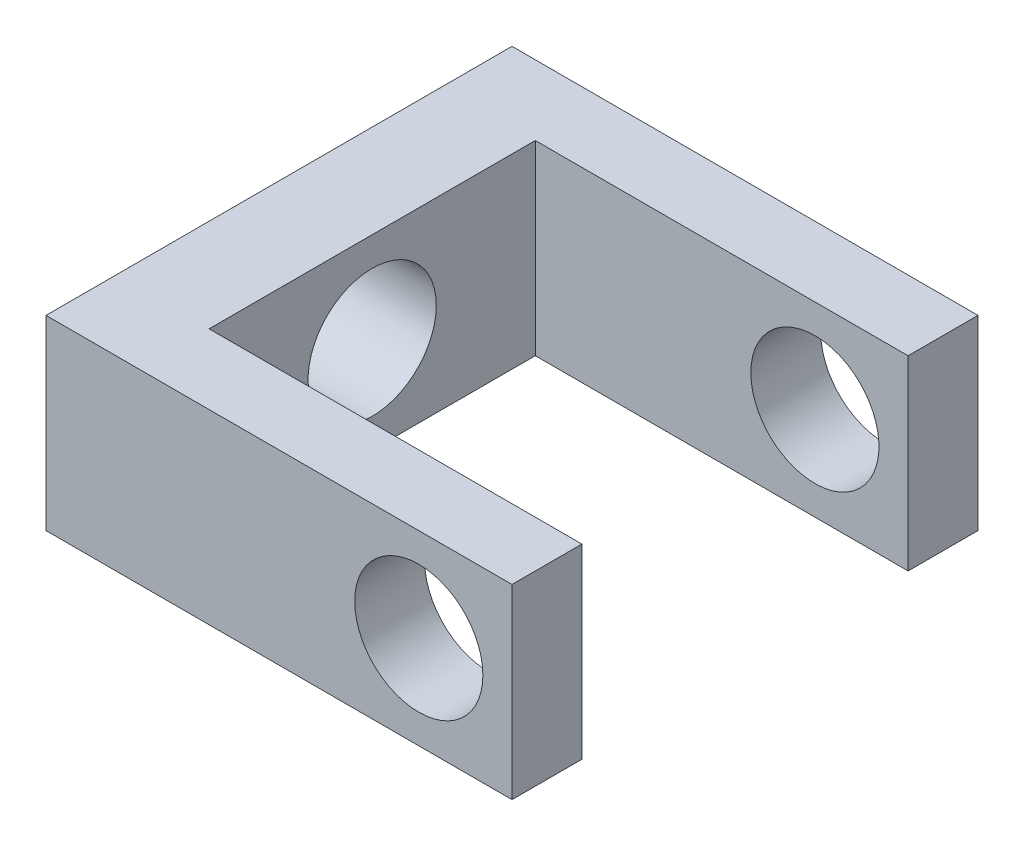
ISO-10303-21;
HEADER;
FILE_DESCRIPTION(('STEP AP214'),'2;1');
FILE_NAME('part.step','',(''),(''),'','','');
FILE_SCHEMA(('AUTOMOTIVE_DESIGN { 1 0 10303 214 1 1 1 1 }'));
ENDSEC;
DATA;
#1=APPLICATION_CONTEXT('core data for automotive mechanical design processes');
#2=APPLICATION_PROTOCOL_DEFINITION('international standard','automotive_design',2000,#1);
#3=PRODUCT_CONTEXT('',#1,'mechanical');
#4=PRODUCT('Part','Part','',(#3));
#5=PRODUCT_RELATED_PRODUCT_CATEGORY('part','',(#4));
#6=PRODUCT_DEFINITION_FORMATION('','',#4);
#7=PRODUCT_DEFINITION_CONTEXT('part definition',#1,'design');
#8=PRODUCT_DEFINITION('design','',#6,#7);
#9=PRODUCT_DEFINITION_SHAPE('','',#8);
#10=(LENGTH_UNIT() NAMED_UNIT(*) SI_UNIT(.MILLI.,.METRE.));
#11=(NAMED_UNIT(*) PLANE_ANGLE_UNIT() SI_UNIT($,.RADIAN.));
#12=(NAMED_UNIT(*) SI_UNIT($,.STERADIAN.) SOLID_ANGLE_UNIT());
#13=UNCERTAINTY_MEASURE_WITH_UNIT(LENGTH_MEASURE(1.E-05),#10,'distance_accuracy_value','');
#14=(GEOMETRIC_REPRESENTATION_CONTEXT(3) GLOBAL_UNCERTAINTY_ASSIGNED_CONTEXT((#13)) GLOBAL_UNIT_ASSIGNED_CONTEXT((#10,
#11,#12)) REPRESENTATION_CONTEXT('',''));
#15=CARTESIAN_POINT('',(0.,0.,0.));
#16=DIRECTION('',(0.,0.,1.));
#17=DIRECTION('',(1.,0.,0.));
#18=AXIS2_PLACEMENT_3D('',#15,#16,#17);
#19=CARTESIAN_POINT('',(10.,-4.,20.));
#20=DIRECTION('',(-1.,0.,0.));
#21=DIRECTION('',(0.,0.,1.));
#22=AXIS2_PLACEMENT_3D('',#19,#20,#21);
#23=PLANE('',#22);
#24=DIRECTION('',(0.,1.,0.));
#25=VECTOR('',#24,1.);
#26=CARTESIAN_POINT('',(10.,0.,17.));
#27=LINE('',#26,#25);
#28=CARTESIAN_POINT('',(10.,-4.,17.));
#29=VERTEX_POINT('',#28);
#30=CARTESIAN_POINT('',(10.,4.,17.));
#31=VERTEX_POINT('',#30);
#32=EDGE_CURVE('E130',#29,#31,#27,.T.);
#33=ORIENTED_EDGE('',*,*,#32,.T.);
#34=DIRECTION('',(0.,0.,-1.));
#35=VECTOR('',#34,1.);
#36=CARTESIAN_POINT('',(10.,4.,20.));
#37=LINE('',#36,#35);
#38=CARTESIAN_POINT('',(10.,4.,20.));
#39=VERTEX_POINT('',#38);
#40=EDGE_CURVE('E11',#39,#31,#37,.T.);
#41=ORIENTED_EDGE('',*,*,#40,.F.);
#42=DIRECTION('',(0.,1.,0.));
#43=VECTOR('',#42,1.);
#44=CARTESIAN_POINT('',(10.,-4.,20.));
#45=LINE('',#44,#43);
#46=CARTESIAN_POINT('',(10.,-4.,20.));
#47=VERTEX_POINT('',#46);
#48=EDGE_CURVE('E146',#47,#39,#45,.T.);
#49=ORIENTED_EDGE('',*,*,#48,.F.);
#50=DIRECTION('',(0.,0.,-1.));
#51=VECTOR('',#50,1.);
#52=CARTESIAN_POINT('',(10.,-4.,20.));
#53=LINE('',#52,#51);
#54=EDGE_CURVE('E159',#47,#29,#53,.T.);
#55=ORIENTED_EDGE('',*,*,#54,.T.);
#56=EDGE_LOOP('',(#33,#41,#49,#55));
#57=FACE_BOUND('',#56,.T.);
#58=ADVANCED_FACE('F39',(#57),#23,.F.);
#59=CARTESIAN_POINT('',(-10.,4.,20.));
#60=DIRECTION('',(0.,-1.,0.));
#61=DIRECTION('',(0.,0.,-1.));
#62=AXIS2_PLACEMENT_3D('',#59,#60,#61);
#63=PLANE('',#62);
#64=DIRECTION('',(1.,0.,0.));
#65=VECTOR('',#64,1.);
#66=CARTESIAN_POINT('',(-6.,4.,17.));
#67=LINE('',#66,#65);
#68=CARTESIAN_POINT('',(-6.,4.,17.));
#69=VERTEX_POINT('',#68);
#70=EDGE_CURVE('E134',#69,#31,#67,.T.);
#71=ORIENTED_EDGE('',*,*,#70,.F.);
#72=DIRECTION('',(0.,0.,1.));
#73=VECTOR('',#72,1.);
#74=CARTESIAN_POINT('',(-6.,4.,0.));
#75=LINE('',#74,#73);
#76=CARTESIAN_POINT('',(-6.,4.,3.));
#77=VERTEX_POINT('',#76);
#78=EDGE_CURVE('E123',#77,#69,#75,.T.);
#79=ORIENTED_EDGE('',*,*,#78,.F.);
#80=DIRECTION('',(1.,0.,0.));
#81=VECTOR('',#80,1.);
#82=CARTESIAN_POINT('',(-6.,4.,3.));
#83=LINE('',#82,#81);
#84=CARTESIAN_POINT('',(10.,4.,3.));
#85=VERTEX_POINT('',#84);
#86=EDGE_CURVE('E121',#77,#85,#83,.T.);
#87=ORIENTED_EDGE('',*,*,#86,.T.);
#88=CARTESIAN_POINT('',(10.,4.,0.));
#89=VERTEX_POINT('',#88);
#90=EDGE_CURVE('E48',#85,#89,#37,.T.);
#91=ORIENTED_EDGE('',*,*,#90,.T.);
#92=DIRECTION('',(-1.,0.,0.));
#93=VECTOR('',#92,1.);
#94=CARTESIAN_POINT('',(-10.,4.,0.));
#95=LINE('',#94,#93);
#96=CARTESIAN_POINT('',(-10.,4.,0.));
#97=VERTEX_POINT('',#96);
#98=EDGE_CURVE('E154',#89,#97,#95,.T.);
#99=ORIENTED_EDGE('',*,*,#98,.T.);
#100=DIRECTION('',(0.,0.,-1.));
#101=VECTOR('',#100,1.);
#102=CARTESIAN_POINT('',(-10.,4.,20.));
#103=LINE('',#102,#101);
#104=CARTESIAN_POINT('',(-10.,4.,20.));
#105=VERTEX_POINT('',#104);
#106=EDGE_CURVE('E165',#105,#97,#103,.T.);
#107=ORIENTED_EDGE('',*,*,#106,.F.);
#108=DIRECTION('',(-1.,0.,0.));
#109=VECTOR('',#108,1.);
#110=CARTESIAN_POINT('',(-10.,4.,20.));
#111=LINE('',#110,#109);
#112=EDGE_CURVE('E94',#39,#105,#111,.T.);
#113=ORIENTED_EDGE('',*,*,#112,.F.);
#114=ORIENTED_EDGE('',*,*,#40,.T.);
#115=EDGE_LOOP('',(#71,#79,#87,#91,#99,#107,#113,#114));
#116=FACE_BOUND('',#115,.T.);
#117=ADVANCED_FACE('F205',(#116),#63,.F.);
#118=CARTESIAN_POINT('',(-10.,-4.,20.));
#119=DIRECTION('',(0.,1.,0.));
#120=DIRECTION('',(0.,0.,1.));
#121=AXIS2_PLACEMENT_3D('',#118,#119,#120);
#122=PLANE('',#121);
#123=DIRECTION('',(1.,0.,0.));
#124=VECTOR('',#123,1.);
#125=CARTESIAN_POINT('',(-6.,-4.,17.));
#126=LINE('',#125,#124);
#127=CARTESIAN_POINT('',(-6.,-4.,17.));
#128=VERTEX_POINT('',#127);
#129=EDGE_CURVE('E169',#128,#29,#126,.T.);
#130=ORIENTED_EDGE('',*,*,#129,.T.);
#131=ORIENTED_EDGE('',*,*,#54,.F.);
#132=DIRECTION('',(1.,0.,0.));
#133=VECTOR('',#132,1.);
#134=CARTESIAN_POINT('',(-10.,-4.,20.));
#135=LINE('',#134,#133);
#136=CARTESIAN_POINT('',(-10.,-4.,20.));
#137=VERTEX_POINT('',#136);
#138=EDGE_CURVE('E65',#137,#47,#135,.T.);
#139=ORIENTED_EDGE('',*,*,#138,.F.);
#140=DIRECTION('',(0.,0.,-1.));
#141=VECTOR('',#140,1.);
#142=CARTESIAN_POINT('',(-10.,-4.,20.));
#143=LINE('',#142,#141);
#144=CARTESIAN_POINT('',(-10.,-4.,0.));
#145=VERTEX_POINT('',#144);
#146=EDGE_CURVE('E162',#137,#145,#143,.T.);
#147=ORIENTED_EDGE('',*,*,#146,.T.);
#148=DIRECTION('',(1.,0.,0.));
#149=VECTOR('',#148,1.);
#150=CARTESIAN_POINT('',(-10.,-4.,0.));
#151=LINE('',#150,#149);
#152=CARTESIAN_POINT('',(10.,-4.,0.));
#153=VERTEX_POINT('',#152);
#154=EDGE_CURVE('E148',#145,#153,#151,.T.);
#155=ORIENTED_EDGE('',*,*,#154,.T.);
#156=CARTESIAN_POINT('',(10.,-4.,3.));
#157=VERTEX_POINT('',#156);
#158=EDGE_CURVE('E87',#157,#153,#53,.T.);
#159=ORIENTED_EDGE('',*,*,#158,.F.);
#160=DIRECTION('',(1.,0.,0.));
#161=VECTOR('',#160,1.);
#162=CARTESIAN_POINT('',(-6.,-4.,3.));
#163=LINE('',#162,#161);
#164=CARTESIAN_POINT('',(-6.,-4.,3.));
#165=VERTEX_POINT('',#164);
#166=EDGE_CURVE('E119',#165,#157,#163,.T.);
#167=ORIENTED_EDGE('',*,*,#166,.F.);
#168=DIRECTION('',(0.,0.,-1.));
#169=VECTOR('',#168,1.);
#170=CARTESIAN_POINT('',(-6.,-4.,0.));
#171=LINE('',#170,#169);
#172=EDGE_CURVE('E124',#128,#165,#171,.T.);
#173=ORIENTED_EDGE('',*,*,#172,.F.);
#174=EDGE_LOOP('',(#130,#131,#139,#147,#155,#159,#167,#173));
#175=FACE_BOUND('',#174,.T.);
#176=ADVANCED_FACE('F132',(#175),#122,.F.);
#177=CARTESIAN_POINT('',(6.,0.,20.));
#178=DIRECTION('',(0.,0.,-1.));
#179=DIRECTION('',(-1.,0.,0.));
#180=AXIS2_PLACEMENT_3D('',#177,#178,#179);
#181=CYLINDRICAL_SURFACE('',#180,2.75);
#182=CARTESIAN_POINT('',(6.,0.,20.));
#183=DIRECTION('',(0.,0.,1.));
#184=DIRECTION('',(1.,0.,0.));
#185=AXIS2_PLACEMENT_3D('',#182,#183,#184);
#186=CIRCLE('',#185,2.75);
#187=CARTESIAN_POINT('',(8.75,0.,20.));
#188=VERTEX_POINT('',#187);
#189=EDGE_CURVE('E139',#188,#188,#186,.T.);
#190=ORIENTED_EDGE('',*,*,#189,.T.);
#191=EDGE_LOOP('',(#190));
#192=FACE_BOUND('',#191,.T.);
#193=CARTESIAN_POINT('',(6.,0.,17.));
#194=DIRECTION('',(0.,0.,-1.));
#195=DIRECTION('',(-1.,0.,0.));
#196=AXIS2_PLACEMENT_3D('',#193,#194,#195);
#197=CIRCLE('',#196,2.75);
#198=CARTESIAN_POINT('',(3.25,0.,17.));
#199=VERTEX_POINT('',#198);
#200=EDGE_CURVE('E43',#199,#199,#197,.T.);
#201=ORIENTED_EDGE('',*,*,#200,.T.);
#202=EDGE_LOOP('',(#201));
#203=FACE_BOUND('',#202,.T.);
#204=ADVANCED_FACE('F234',(#192,#203),#181,.F.);
#205=CARTESIAN_POINT('',(0.,0.,20.));
#206=DIRECTION('',(0.,0.,-1.));
#207=DIRECTION('',(-1.,0.,0.));
#208=AXIS2_PLACEMENT_3D('',#205,#206,#207);
#209=PLANE('',#208);
#210=ORIENTED_EDGE('',*,*,#48,.T.);
#211=ORIENTED_EDGE('',*,*,#112,.T.);
#212=DIRECTION('',(0.,-1.,0.));
#213=VECTOR('',#212,1.);
#214=CARTESIAN_POINT('',(-10.,-4.,20.));
#215=LINE('',#214,#213);
#216=EDGE_CURVE('E150',#105,#137,#215,.T.);
#217=ORIENTED_EDGE('',*,*,#216,.T.);
#218=ORIENTED_EDGE('',*,*,#138,.T.);
#219=EDGE_LOOP('',(#210,#211,#217,#218));
#220=FACE_BOUND('',#219,.T.);
#221=ORIENTED_EDGE('',*,*,#189,.F.);
#222=EDGE_LOOP('',(#221));
#223=FACE_BOUND('',#222,.T.);
#224=ADVANCED_FACE('F218',(#220,#223),#209,.F.);
#225=CARTESIAN_POINT('',(0.,0.,0.));
#226=DIRECTION('',(0.,0.,-1.));
#227=DIRECTION('',(-1.,0.,0.));
#228=AXIS2_PLACEMENT_3D('',#225,#226,#227);
#229=PLANE('',#228);
#230=DIRECTION('',(0.,1.,0.));
#231=VECTOR('',#230,1.);
#232=CARTESIAN_POINT('',(10.,-4.,0.));
#233=LINE('',#232,#231);
#234=EDGE_CURVE('E142',#153,#89,#233,.T.);
#235=ORIENTED_EDGE('',*,*,#234,.F.);
#236=ORIENTED_EDGE('',*,*,#154,.F.);
#237=DIRECTION('',(0.,-1.,0.));
#238=VECTOR('',#237,1.);
#239=CARTESIAN_POINT('',(-10.,-4.,0.));
#240=LINE('',#239,#238);
#241=EDGE_CURVE('E156',#97,#145,#240,.T.);
#242=ORIENTED_EDGE('',*,*,#241,.F.);
#243=ORIENTED_EDGE('',*,*,#98,.F.);
#244=EDGE_LOOP('',(#235,#236,#242,#243));
#245=FACE_BOUND('',#244,.T.);
#246=CARTESIAN_POINT('',(6.,0.,0.));
#247=DIRECTION('',(0.,0.,1.));
#248=DIRECTION('',(1.,0.,0.));
#249=AXIS2_PLACEMENT_3D('',#246,#247,#248);
#250=CIRCLE('',#249,2.75);
#251=CARTESIAN_POINT('',(8.75,0.,0.));
#252=VERTEX_POINT('',#251);
#253=EDGE_CURVE('E143',#252,#252,#250,.T.);
#254=ORIENTED_EDGE('',*,*,#253,.T.);
#255=EDGE_LOOP('',(#254));
#256=FACE_BOUND('',#255,.T.);
#257=ADVANCED_FACE('F211',(#245,#256),#229,.T.);
#258=ORIENTED_EDGE('',*,*,#90,.F.);
#259=DIRECTION('',(0.,1.,0.));
#260=VECTOR('',#259,1.);
#261=CARTESIAN_POINT('',(10.,0.,3.));
#262=LINE('',#261,#260);
#263=EDGE_CURVE('E177',#157,#85,#262,.T.);
#264=ORIENTED_EDGE('',*,*,#263,.F.);
#265=ORIENTED_EDGE('',*,*,#158,.T.);
#266=ORIENTED_EDGE('',*,*,#234,.T.);
#267=EDGE_LOOP('',(#258,#264,#265,#266));
#268=FACE_BOUND('',#267,.T.);
#269=ADVANCED_FACE('F41',(#268),#23,.F.);
#270=CARTESIAN_POINT('',(-10.,-4.,20.));
#271=DIRECTION('',(1.,0.,0.));
#272=DIRECTION('',(0.,0.,-1.));
#273=AXIS2_PLACEMENT_3D('',#270,#271,#272);
#274=PLANE('',#273);
#275=CARTESIAN_POINT('',(-10.,0.,10.));
#276=DIRECTION('',(1.,0.,0.));
#277=DIRECTION('',(0.,0.,-1.));
#278=AXIS2_PLACEMENT_3D('',#275,#276,#277);
#279=CIRCLE('',#278,2.75);
#280=CARTESIAN_POINT('',(-10.,0.,7.25));
#281=VERTEX_POINT('',#280);
#282=EDGE_CURVE('E178',#281,#281,#279,.T.);
#283=ORIENTED_EDGE('',*,*,#282,.T.);
#284=EDGE_LOOP('',(#283));
#285=FACE_BOUND('',#284,.T.);
#286=ORIENTED_EDGE('',*,*,#241,.T.);
#287=ORIENTED_EDGE('',*,*,#146,.F.);
#288=ORIENTED_EDGE('',*,*,#216,.F.);
#289=ORIENTED_EDGE('',*,*,#106,.T.);
#290=EDGE_LOOP('',(#286,#287,#288,#289));
#291=FACE_BOUND('',#290,.T.);
#292=ADVANCED_FACE('F187',(#285,#291),#274,.F.);
#293=CARTESIAN_POINT('',(6.,0.,3.));
#294=DIRECTION('',(0.,0.,-1.));
#295=DIRECTION('',(-1.,0.,0.));
#296=AXIS2_PLACEMENT_3D('',#293,#294,#295);
#297=CIRCLE('',#296,2.75);
#298=CARTESIAN_POINT('',(3.25,0.,3.));
#299=VERTEX_POINT('',#298);
#300=EDGE_CURVE('E167',#299,#299,#297,.T.);
#301=ORIENTED_EDGE('',*,*,#300,.F.);
#302=EDGE_LOOP('',(#301));
#303=FACE_BOUND('',#302,.T.);
#304=ORIENTED_EDGE('',*,*,#253,.F.);
#305=EDGE_LOOP('',(#304));
#306=FACE_BOUND('',#305,.T.);
#307=ADVANCED_FACE('F216',(#303,#306),#181,.F.);
#308=CARTESIAN_POINT('',(-6.,0.,17.));
#309=DIRECTION('',(0.,0.,-1.));
#310=DIRECTION('',(-1.,0.,0.));
#311=AXIS2_PLACEMENT_3D('',#308,#309,#310);
#312=PLANE('',#311);
#313=ORIENTED_EDGE('',*,*,#200,.F.);
#314=EDGE_LOOP('',(#313));
#315=FACE_BOUND('',#314,.T.);
#316=ORIENTED_EDGE('',*,*,#32,.F.);
#317=ORIENTED_EDGE('',*,*,#129,.F.);
#318=DIRECTION('',(0.,1.,0.));
#319=VECTOR('',#318,1.);
#320=CARTESIAN_POINT('',(-6.,0.,17.));
#321=LINE('',#320,#319);
#322=EDGE_CURVE('E56',#128,#69,#321,.T.);
#323=ORIENTED_EDGE('',*,*,#322,.T.);
#324=ORIENTED_EDGE('',*,*,#70,.T.);
#325=EDGE_LOOP('',(#316,#317,#323,#324));
#326=FACE_BOUND('',#325,.T.);
#327=ADVANCED_FACE('F201',(#315,#326),#312,.T.);
#328=CARTESIAN_POINT('',(-6.,0.,3.));
#329=DIRECTION('',(0.,0.,-1.));
#330=DIRECTION('',(-1.,0.,0.));
#331=AXIS2_PLACEMENT_3D('',#328,#329,#330);
#332=PLANE('',#331);
#333=ORIENTED_EDGE('',*,*,#300,.T.);
#334=EDGE_LOOP('',(#333));
#335=FACE_BOUND('',#334,.T.);
#336=ORIENTED_EDGE('',*,*,#263,.T.);
#337=ORIENTED_EDGE('',*,*,#86,.F.);
#338=DIRECTION('',(0.,1.,0.));
#339=VECTOR('',#338,1.);
#340=CARTESIAN_POINT('',(-6.,0.,3.));
#341=LINE('',#340,#339);
#342=EDGE_CURVE('E116',#165,#77,#341,.T.);
#343=ORIENTED_EDGE('',*,*,#342,.F.);
#344=ORIENTED_EDGE('',*,*,#166,.T.);
#345=EDGE_LOOP('',(#336,#337,#343,#344));
#346=FACE_BOUND('',#345,.T.);
#347=ADVANCED_FACE('F117',(#335,#346),#332,.F.);
#348=CARTESIAN_POINT('',(-6.,0.,0.));
#349=DIRECTION('',(1.,0.,0.));
#350=DIRECTION('',(0.,0.,-1.));
#351=AXIS2_PLACEMENT_3D('',#348,#349,#350);
#352=PLANE('',#351);
#353=CARTESIAN_POINT('',(-6.,0.,10.));
#354=DIRECTION('',(1.,0.,0.));
#355=DIRECTION('',(0.,0.,-1.));
#356=AXIS2_PLACEMENT_3D('',#353,#354,#355);
#357=CIRCLE('',#356,2.75);
#358=CARTESIAN_POINT('',(-6.,0.,7.25));
#359=VERTEX_POINT('',#358);
#360=EDGE_CURVE('E181',#359,#359,#357,.T.);
#361=ORIENTED_EDGE('',*,*,#360,.F.);
#362=EDGE_LOOP('',(#361));
#363=FACE_BOUND('',#362,.T.);
#364=ORIENTED_EDGE('',*,*,#172,.T.);
#365=ORIENTED_EDGE('',*,*,#342,.T.);
#366=ORIENTED_EDGE('',*,*,#78,.T.);
#367=ORIENTED_EDGE('',*,*,#322,.F.);
#368=EDGE_LOOP('',(#364,#365,#366,#367));
#369=FACE_BOUND('',#368,.T.);
#370=ADVANCED_FACE('F127',(#363,#369),#352,.T.);
#371=CARTESIAN_POINT('',(-10.,0.,10.));
#372=DIRECTION('',(1.,0.,0.));
#373=DIRECTION('',(0.,0.,-1.));
#374=AXIS2_PLACEMENT_3D('',#371,#372,#373);
#375=CYLINDRICAL_SURFACE('',#374,2.75);
#376=ORIENTED_EDGE('',*,*,#282,.F.);
#377=EDGE_LOOP('',(#376));
#378=FACE_BOUND('',#377,.T.);
#379=ORIENTED_EDGE('',*,*,#360,.T.);
#380=EDGE_LOOP('',(#379));
#381=FACE_BOUND('',#380,.T.);
#382=ADVANCED_FACE('F190',(#378,#381),#375,.F.);
#383=CLOSED_SHELL('',(#58,#117,#176,#204,#224,#257,#269,#292,#307,#327,#347,#370,#382));
#384=MANIFOLD_SOLID_BREP('B2',#383);
#385=ADVANCED_BREP_SHAPE_REPRESENTATION('',(#18,#384),#14);
#386=SHAPE_DEFINITION_REPRESENTATION(#9,#385);
ENDSEC;
END-ISO-10303-21;
